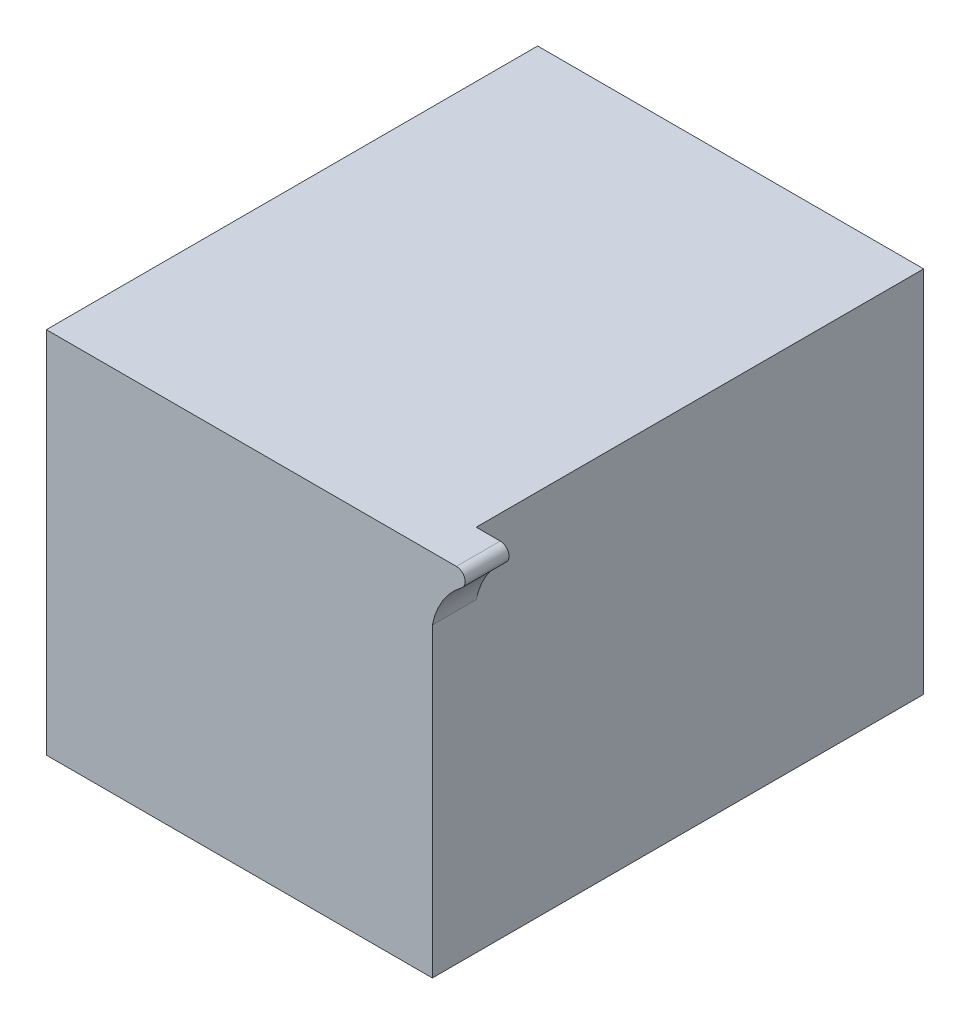
ISO-10303-21;
HEADER;
FILE_DESCRIPTION(('STEP AP214'),'2;1');
FILE_NAME('part.step','',(''),(''),'','','');
FILE_SCHEMA(('AUTOMOTIVE_DESIGN { 1 0 10303 214 1 1 1 1 }'));
ENDSEC;
DATA;
#1=APPLICATION_CONTEXT('core data for automotive mechanical design processes');
#2=APPLICATION_PROTOCOL_DEFINITION('international standard','automotive_design',2000,#1);
#3=PRODUCT_CONTEXT('',#1,'mechanical');
#4=PRODUCT('Part','Part','',(#3));
#5=PRODUCT_RELATED_PRODUCT_CATEGORY('part','',(#4));
#6=PRODUCT_DEFINITION_FORMATION('','',#4);
#7=PRODUCT_DEFINITION_CONTEXT('part definition',#1,'design');
#8=PRODUCT_DEFINITION('design','',#6,#7);
#9=PRODUCT_DEFINITION_SHAPE('','',#8);
#10=(LENGTH_UNIT() NAMED_UNIT(*) SI_UNIT(.MILLI.,.METRE.));
#11=(NAMED_UNIT(*) PLANE_ANGLE_UNIT() SI_UNIT($,.RADIAN.));
#12=(NAMED_UNIT(*) SI_UNIT($,.STERADIAN.) SOLID_ANGLE_UNIT());
#13=UNCERTAINTY_MEASURE_WITH_UNIT(LENGTH_MEASURE(1.E-05),#10,'distance_accuracy_value','');
#14=(GEOMETRIC_REPRESENTATION_CONTEXT(3) GLOBAL_UNCERTAINTY_ASSIGNED_CONTEXT((#13)) GLOBAL_UNIT_ASSIGNED_CONTEXT((#10,
#11,#12)) REPRESENTATION_CONTEXT('',''));
#15=CARTESIAN_POINT('',(0.,0.,0.));
#16=DIRECTION('',(0.,0.,1.));
#17=DIRECTION('',(1.,0.,0.));
#18=AXIS2_PLACEMENT_3D('',#15,#16,#17);
#19=CARTESIAN_POINT('',(44.,0.,-56.));
#20=DIRECTION('',(1.,0.,0.));
#21=DIRECTION('',(0.,0.,-1.));
#22=AXIS2_PLACEMENT_3D('',#19,#20,#21);
#23=PLANE('',#22);
#24=DIRECTION('',(0.,0.,1.));
#25=VECTOR('',#24,1.);
#26=CARTESIAN_POINT('',(44.,42.,-56.));
#27=LINE('',#26,#25);
#28=CARTESIAN_POINT('',(44.,42.,-56.));
#29=VERTEX_POINT('',#28);
#30=CARTESIAN_POINT('',(44.,42.,-5.));
#31=VERTEX_POINT('',#30);
#32=EDGE_CURVE('E116',#29,#31,#27,.T.);
#33=ORIENTED_EDGE('',*,*,#32,.T.);
#34=DIRECTION('',(0.,-1.,0.));
#35=VECTOR('',#34,1.);
#36=CARTESIAN_POINT('',(44.,34.8522433477477,-5.));
#37=LINE('',#36,#35);
#38=CARTESIAN_POINT('',(44.,34.8522433477477,-5.));
#39=VERTEX_POINT('',#38);
#40=EDGE_CURVE('E111',#31,#39,#37,.T.);
#41=ORIENTED_EDGE('',*,*,#40,.T.);
#42=DIRECTION('',(0.,0.,1.));
#43=VECTOR('',#42,1.);
#44=CARTESIAN_POINT('',(44.,34.8522433477477,-5.));
#45=LINE('',#44,#43);
#46=CARTESIAN_POINT('',(44.,34.8522433477477,0.));
#47=VERTEX_POINT('',#46);
#48=EDGE_CURVE('E94',#39,#47,#45,.T.);
#49=ORIENTED_EDGE('',*,*,#48,.T.);
#50=DIRECTION('',(0.,1.,0.));
#51=VECTOR('',#50,1.);
#52=CARTESIAN_POINT('',(44.,0.,0.));
#53=LINE('',#52,#51);
#54=CARTESIAN_POINT('',(44.,0.,0.));
#55=VERTEX_POINT('',#54);
#56=EDGE_CURVE('E139',#55,#47,#53,.T.);
#57=ORIENTED_EDGE('',*,*,#56,.F.);
#58=DIRECTION('',(0.,0.,1.));
#59=VECTOR('',#58,1.);
#60=CARTESIAN_POINT('',(44.,0.,-56.));
#61=LINE('',#60,#59);
#62=CARTESIAN_POINT('',(44.,0.,-56.));
#63=VERTEX_POINT('',#62);
#64=EDGE_CURVE('E147',#63,#55,#61,.T.);
#65=ORIENTED_EDGE('',*,*,#64,.F.);
#66=DIRECTION('',(0.,1.,0.));
#67=VECTOR('',#66,1.);
#68=CARTESIAN_POINT('',(44.,0.,-56.));
#69=LINE('',#68,#67);
#70=EDGE_CURVE('E128',#63,#29,#69,.T.);
#71=ORIENTED_EDGE('',*,*,#70,.T.);
#72=EDGE_LOOP('',(#33,#41,#49,#57,#65,#71));
#73=FACE_BOUND('',#72,.T.);
#74=ADVANCED_FACE('F37',(#73),#23,.T.);
#75=CARTESIAN_POINT('',(0.,0.,-56.));
#76=DIRECTION('',(-1.,0.,0.));
#77=DIRECTION('',(0.,0.,1.));
#78=AXIS2_PLACEMENT_3D('',#75,#76,#77);
#79=PLANE('',#78);
#80=DIRECTION('',(0.,-1.,0.));
#81=VECTOR('',#80,1.);
#82=CARTESIAN_POINT('',(0.,0.,0.));
#83=LINE('',#82,#81);
#84=CARTESIAN_POINT('',(0.,42.,0.));
#85=VERTEX_POINT('',#84);
#86=CARTESIAN_POINT('',(0.,0.,0.));
#87=VERTEX_POINT('',#86);
#88=EDGE_CURVE('E105',#85,#87,#83,.T.);
#89=ORIENTED_EDGE('',*,*,#88,.F.);
#90=DIRECTION('',(0.,0.,1.));
#91=VECTOR('',#90,1.);
#92=CARTESIAN_POINT('',(0.,42.,-56.));
#93=LINE('',#92,#91);
#94=CARTESIAN_POINT('',(0.,42.,-56.));
#95=VERTEX_POINT('',#94);
#96=EDGE_CURVE('E142',#95,#85,#93,.T.);
#97=ORIENTED_EDGE('',*,*,#96,.F.);
#98=DIRECTION('',(0.,-1.,0.));
#99=VECTOR('',#98,1.);
#100=CARTESIAN_POINT('',(0.,0.,-56.));
#101=LINE('',#100,#99);
#102=CARTESIAN_POINT('',(0.,0.,-56.));
#103=VERTEX_POINT('',#102);
#104=EDGE_CURVE('E121',#95,#103,#101,.T.);
#105=ORIENTED_EDGE('',*,*,#104,.T.);
#106=DIRECTION('',(0.,0.,1.));
#107=VECTOR('',#106,1.);
#108=CARTESIAN_POINT('',(0.,0.,-56.));
#109=LINE('',#108,#107);
#110=EDGE_CURVE('E133',#103,#87,#109,.T.);
#111=ORIENTED_EDGE('',*,*,#110,.T.);
#112=EDGE_LOOP('',(#89,#97,#105,#111));
#113=FACE_BOUND('',#112,.T.);
#114=ADVANCED_FACE('F164',(#113),#79,.T.);
#115=CARTESIAN_POINT('',(0.,42.,-56.));
#116=DIRECTION('',(0.,1.,0.));
#117=DIRECTION('',(0.,0.,1.));
#118=AXIS2_PLACEMENT_3D('',#115,#116,#117);
#119=PLANE('',#118);
#120=DIRECTION('',(-1.,0.,0.));
#121=VECTOR('',#120,1.);
#122=CARTESIAN_POINT('',(0.,42.,0.));
#123=LINE('',#122,#121);
#124=CARTESIAN_POINT('',(46.7390418512116,42.,0.));
#125=VERTEX_POINT('',#124);
#126=EDGE_CURVE('E125',#125,#85,#123,.T.);
#127=ORIENTED_EDGE('',*,*,#126,.F.);
#128=DIRECTION('',(0.,0.,1.));
#129=VECTOR('',#128,1.);
#130=CARTESIAN_POINT('',(46.7390418512116,42.,-56.));
#131=LINE('',#130,#129);
#132=CARTESIAN_POINT('',(46.7390418512116,42.,-5.));
#133=VERTEX_POINT('',#132);
#134=EDGE_CURVE('E45',#125,#133,#131,.F.);
#135=ORIENTED_EDGE('',*,*,#134,.T.);
#136=DIRECTION('',(-1.,0.,0.));
#137=VECTOR('',#136,1.);
#138=CARTESIAN_POINT('',(44.,42.,-5.));
#139=LINE('',#138,#137);
#140=EDGE_CURVE('E106',#133,#31,#139,.T.);
#141=ORIENTED_EDGE('',*,*,#140,.T.);
#142=ORIENTED_EDGE('',*,*,#32,.F.);
#143=DIRECTION('',(-1.,0.,0.));
#144=VECTOR('',#143,1.);
#145=CARTESIAN_POINT('',(0.,42.,-56.));
#146=LINE('',#145,#144);
#147=EDGE_CURVE('E130',#29,#95,#146,.T.);
#148=ORIENTED_EDGE('',*,*,#147,.T.);
#149=ORIENTED_EDGE('',*,*,#96,.T.);
#150=EDGE_LOOP('',(#127,#135,#141,#142,#148,#149));
#151=FACE_BOUND('',#150,.T.);
#152=ADVANCED_FACE('F165',(#151),#119,.T.);
#153=CARTESIAN_POINT('',(0.,0.,-56.));
#154=DIRECTION('',(0.,-1.,0.));
#155=DIRECTION('',(0.,0.,-1.));
#156=AXIS2_PLACEMENT_3D('',#153,#154,#155);
#157=PLANE('',#156);
#158=DIRECTION('',(1.,0.,0.));
#159=VECTOR('',#158,1.);
#160=CARTESIAN_POINT('',(0.,0.,0.));
#161=LINE('',#160,#159);
#162=EDGE_CURVE('E136',#87,#55,#161,.T.);
#163=ORIENTED_EDGE('',*,*,#162,.F.);
#164=ORIENTED_EDGE('',*,*,#110,.F.);
#165=DIRECTION('',(1.,0.,0.));
#166=VECTOR('',#165,1.);
#167=CARTESIAN_POINT('',(0.,0.,-56.));
#168=LINE('',#167,#166);
#169=EDGE_CURVE('E124',#103,#63,#168,.T.);
#170=ORIENTED_EDGE('',*,*,#169,.T.);
#171=ORIENTED_EDGE('',*,*,#64,.T.);
#172=EDGE_LOOP('',(#163,#164,#170,#171));
#173=FACE_BOUND('',#172,.T.);
#174=ADVANCED_FACE('F161',(#173),#157,.T.);
#175=CARTESIAN_POINT('',(0.,0.,-56.));
#176=DIRECTION('',(0.,0.,-1.));
#177=DIRECTION('',(-1.,0.,0.));
#178=AXIS2_PLACEMENT_3D('',#175,#176,#177);
#179=PLANE('',#178);
#180=ORIENTED_EDGE('',*,*,#104,.F.);
#181=ORIENTED_EDGE('',*,*,#147,.F.);
#182=ORIENTED_EDGE('',*,*,#70,.F.);
#183=ORIENTED_EDGE('',*,*,#169,.F.);
#184=EDGE_LOOP('',(#180,#181,#182,#183));
#185=FACE_BOUND('',#184,.T.);
#186=ADVANCED_FACE('F160',(#185),#179,.T.);
#187=CARTESIAN_POINT('',(0.,0.,0.));
#188=DIRECTION('',(0.,0.,-1.));
#189=DIRECTION('',(-1.,0.,0.));
#190=AXIS2_PLACEMENT_3D('',#187,#188,#189);
#191=PLANE('',#190);
#192=CARTESIAN_POINT('',(52.6916512229162,33.1416104169736,0.));
#193=DIRECTION('',(0.,0.,-1.));
#194=DIRECTION('',(1.,0.,0.));
#195=AXIS2_PLACEMENT_3D('',#192,#193,#194);
#196=CIRCLE('',#195,8.85838958302637);
#197=CARTESIAN_POINT('',(47.3428533887424,40.2028728914755,0.));
#198=VERTEX_POINT('',#197);
#199=EDGE_CURVE('E100',#47,#198,#196,.T.);
#200=ORIENTED_EDGE('',*,*,#199,.T.);
#201=CARTESIAN_POINT('',(46.7390418512116,41.,0.));
#202=DIRECTION('',(0.,0.,-1.));
#203=DIRECTION('',(-1.,0.,0.));
#204=AXIS2_PLACEMENT_3D('',#201,#202,#203);
#205=CIRCLE('',#204,1.);
#206=EDGE_CURVE('E59',#198,#125,#205,.F.);
#207=ORIENTED_EDGE('',*,*,#206,.T.);
#208=ORIENTED_EDGE('',*,*,#126,.T.);
#209=ORIENTED_EDGE('',*,*,#88,.T.);
#210=ORIENTED_EDGE('',*,*,#162,.T.);
#211=ORIENTED_EDGE('',*,*,#56,.T.);
#212=EDGE_LOOP('',(#200,#207,#208,#209,#210,#211));
#213=FACE_BOUND('',#212,.T.);
#214=ADVANCED_FACE('F152',(#213),#191,.F.);
#215=CARTESIAN_POINT('',(52.6916512229162,33.1416104169736,-5.));
#216=DIRECTION('',(0.,0.,1.));
#217=DIRECTION('',(1.,0.,0.));
#218=AXIS2_PLACEMENT_3D('',#215,#216,#217);
#219=CYLINDRICAL_SURFACE('',#218,8.85838958302637);
#220=CARTESIAN_POINT('',(52.6916512229162,33.1416104169736,-5.));
#221=DIRECTION('',(0.,0.,-1.));
#222=DIRECTION('',(1.,0.,0.));
#223=AXIS2_PLACEMENT_3D('',#220,#221,#222);
#224=CIRCLE('',#223,8.85838958302637);
#225=CARTESIAN_POINT('',(47.3428533887424,40.2028728914755,-5.));
#226=VERTEX_POINT('',#225);
#227=EDGE_CURVE('E98',#39,#226,#224,.T.);
#228=ORIENTED_EDGE('',*,*,#227,.T.);
#229=DIRECTION('',(0.,0.,1.));
#230=VECTOR('',#229,1.);
#231=CARTESIAN_POINT('',(47.3428533887424,40.2028728914755,-5.));
#232=LINE('',#231,#230);
#233=EDGE_CURVE('E145',#226,#198,#232,.T.);
#234=ORIENTED_EDGE('',*,*,#233,.T.);
#235=ORIENTED_EDGE('',*,*,#199,.F.);
#236=ORIENTED_EDGE('',*,*,#48,.F.);
#237=EDGE_LOOP('',(#228,#234,#235,#236));
#238=FACE_BOUND('',#237,.T.);
#239=ADVANCED_FACE('F96',(#238),#219,.F.);
#240=CARTESIAN_POINT('',(52.6916512229162,33.1416104169736,-5.));
#241=DIRECTION('',(0.,0.,1.));
#242=DIRECTION('',(1.,0.,0.));
#243=AXIS2_PLACEMENT_3D('',#240,#241,#242);
#244=PLANE('',#243);
#245=ORIENTED_EDGE('',*,*,#140,.F.);
#246=CARTESIAN_POINT('',(46.7390418512116,41.,-5.));
#247=DIRECTION('',(0.,0.,1.));
#248=DIRECTION('',(1.,0.,0.));
#249=AXIS2_PLACEMENT_3D('',#246,#247,#248);
#250=CIRCLE('',#249,1.);
#251=EDGE_CURVE('E11',#133,#226,#250,.F.);
#252=ORIENTED_EDGE('',*,*,#251,.T.);
#253=ORIENTED_EDGE('',*,*,#227,.F.);
#254=ORIENTED_EDGE('',*,*,#40,.F.);
#255=EDGE_LOOP('',(#245,#252,#253,#254));
#256=FACE_BOUND('',#255,.T.);
#257=ADVANCED_FACE('F110',(#256),#244,.F.);
#258=CARTESIAN_POINT('',(46.7390418512116,41.,-5.));
#259=DIRECTION('',(0.,0.,1.));
#260=DIRECTION('',(1.,0.,0.));
#261=AXIS2_PLACEMENT_3D('',#258,#259,#260);
#262=CYLINDRICAL_SURFACE('',#261,1.);
#263=ORIENTED_EDGE('',*,*,#251,.F.);
#264=ORIENTED_EDGE('',*,*,#134,.F.);
#265=ORIENTED_EDGE('',*,*,#206,.F.);
#266=ORIENTED_EDGE('',*,*,#233,.F.);
#267=EDGE_LOOP('',(#263,#264,#265,#266));
#268=FACE_BOUND('',#267,.T.);
#269=ADVANCED_FACE('F39',(#268),#262,.T.);
#270=CLOSED_SHELL('',(#74,#114,#152,#174,#186,#214,#239,#257,#269));
#271=MANIFOLD_SOLID_BREP('B2',#270);
#272=ADVANCED_BREP_SHAPE_REPRESENTATION('',(#18,#271),#14);
#273=SHAPE_DEFINITION_REPRESENTATION(#9,#272);
ENDSEC;
END-ISO-10303-21;
